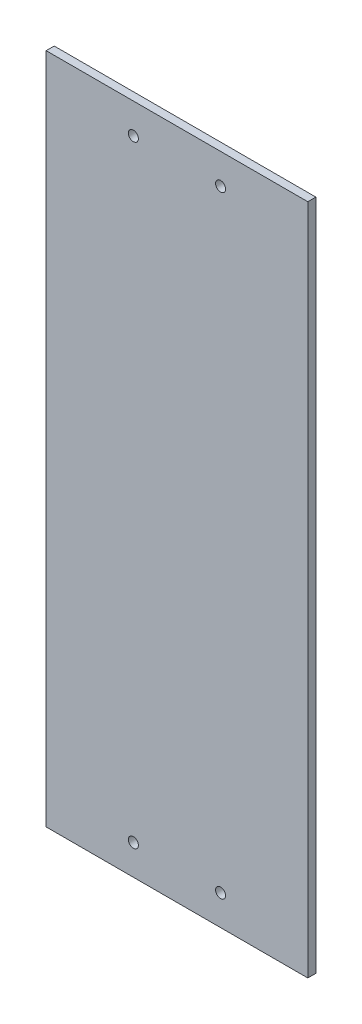
ISO-10303-21;
HEADER;
FILE_DESCRIPTION(('STEP AP214'),'2;1');
FILE_NAME('part.step','',(''),(''),'','','');
FILE_SCHEMA(('AUTOMOTIVE_DESIGN { 1 0 10303 214 1 1 1 1 }'));
ENDSEC;
DATA;
#1=APPLICATION_CONTEXT('core data for automotive mechanical design processes');
#2=APPLICATION_PROTOCOL_DEFINITION('international standard','automotive_design',2000,#1);
#3=PRODUCT_CONTEXT('',#1,'mechanical');
#4=PRODUCT('Part','Part','',(#3));
#5=PRODUCT_RELATED_PRODUCT_CATEGORY('part','',(#4));
#6=PRODUCT_DEFINITION_FORMATION('','',#4);
#7=PRODUCT_DEFINITION_CONTEXT('part definition',#1,'design');
#8=PRODUCT_DEFINITION('design','',#6,#7);
#9=PRODUCT_DEFINITION_SHAPE('','',#8);
#10=(LENGTH_UNIT() NAMED_UNIT(*) SI_UNIT(.MILLI.,.METRE.));
#11=(NAMED_UNIT(*) PLANE_ANGLE_UNIT() SI_UNIT($,.RADIAN.));
#12=(NAMED_UNIT(*) SI_UNIT($,.STERADIAN.) SOLID_ANGLE_UNIT());
#13=UNCERTAINTY_MEASURE_WITH_UNIT(LENGTH_MEASURE(1.E-05),#10,'distance_accuracy_value','');
#14=(GEOMETRIC_REPRESENTATION_CONTEXT(3) GLOBAL_UNCERTAINTY_ASSIGNED_CONTEXT((#13)) GLOBAL_UNIT_ASSIGNED_CONTEXT((#10,
#11,#12)) REPRESENTATION_CONTEXT('',''));
#15=CARTESIAN_POINT('',(0.,0.,0.));
#16=DIRECTION('',(0.,0.,1.));
#17=DIRECTION('',(1.,0.,0.));
#18=AXIS2_PLACEMENT_3D('',#15,#16,#17);
#19=CARTESIAN_POINT('',(0.,0.,4.));
#20=DIRECTION('',(0.,0.,-1.));
#21=DIRECTION('',(-1.,0.,0.));
#22=AXIS2_PLACEMENT_3D('',#19,#20,#21);
#23=PLANE('',#22);
#24=DIRECTION('',(0.,1.,0.));
#25=VECTOR('',#24,1.);
#26=CARTESIAN_POINT('',(53.676310867893,179.876130384089,4.));
#27=LINE('',#26,#25);
#28=CARTESIAN_POINT('',(53.676310867893,-154.123869615911,4.));
#29=VERTEX_POINT('',#28);
#30=CARTESIAN_POINT('',(53.676310867893,179.876130384089,4.));
#31=VERTEX_POINT('',#30);
#32=EDGE_CURVE('E85',#29,#31,#27,.T.);
#33=ORIENTED_EDGE('',*,*,#32,.T.);
#34=DIRECTION('',(-1.,0.,0.));
#35=VECTOR('',#34,1.);
#36=CARTESIAN_POINT('',(53.676310867893,179.876130384089,4.));
#37=LINE('',#36,#35);
#38=CARTESIAN_POINT('',(-76.323689132107,179.876130384089,4.));
#39=VERTEX_POINT('',#38);
#40=EDGE_CURVE('E80',#31,#39,#37,.T.);
#41=ORIENTED_EDGE('',*,*,#40,.T.);
#42=DIRECTION('',(0.,-1.,0.));
#43=VECTOR('',#42,1.);
#44=CARTESIAN_POINT('',(-76.323689132107,179.876130384089,4.));
#45=LINE('',#44,#43);
#46=CARTESIAN_POINT('',(-76.323689132107,-154.123869615911,4.));
#47=VERTEX_POINT('',#46);
#48=EDGE_CURVE('E83',#39,#47,#45,.T.);
#49=ORIENTED_EDGE('',*,*,#48,.T.);
#50=DIRECTION('',(1.,0.,0.));
#51=VECTOR('',#50,1.);
#52=CARTESIAN_POINT('',(53.676310867893,-154.123869615911,4.));
#53=LINE('',#52,#51);
#54=EDGE_CURVE('E50',#47,#29,#53,.T.);
#55=ORIENTED_EDGE('',*,*,#54,.T.);
#56=EDGE_LOOP('',(#33,#41,#49,#55));
#57=FACE_BOUND('',#56,.T.);
#58=CARTESIAN_POINT('',(10.3429775345597,164.876130384089,4.));
#59=DIRECTION('',(0.,0.,1.));
#60=DIRECTION('',(1.,0.,0.));
#61=AXIS2_PLACEMENT_3D('',#58,#59,#60);
#62=CIRCLE('',#61,2.50000000000001);
#63=CARTESIAN_POINT('',(12.8429775345597,164.876130384089,4.));
#64=VERTEX_POINT('',#63);
#65=EDGE_CURVE('E100',#64,#64,#62,.T.);
#66=ORIENTED_EDGE('',*,*,#65,.F.);
#67=EDGE_LOOP('',(#66));
#68=FACE_BOUND('',#67,.T.);
#69=CARTESIAN_POINT('',(-32.9903557987736,164.876130384089,4.));
#70=DIRECTION('',(0.,0.,1.));
#71=DIRECTION('',(1.,0.,0.));
#72=AXIS2_PLACEMENT_3D('',#69,#70,#71);
#73=CIRCLE('',#72,2.5);
#74=CARTESIAN_POINT('',(-30.4903557987736,164.876130384089,4.));
#75=VERTEX_POINT('',#74);
#76=EDGE_CURVE('E115',#75,#75,#73,.T.);
#77=ORIENTED_EDGE('',*,*,#76,.F.);
#78=EDGE_LOOP('',(#77));
#79=FACE_BOUND('',#78,.T.);
#80=CARTESIAN_POINT('',(10.3429775345597,-139.123869615911,4.));
#81=DIRECTION('',(0.,0.,1.));
#82=DIRECTION('',(1.,0.,0.));
#83=AXIS2_PLACEMENT_3D('',#80,#81,#82);
#84=CIRCLE('',#83,2.50000000000001);
#85=CARTESIAN_POINT('',(12.8429775345597,-139.123869615911,4.));
#86=VERTEX_POINT('',#85);
#87=EDGE_CURVE('E121',#86,#86,#84,.T.);
#88=ORIENTED_EDGE('',*,*,#87,.F.);
#89=EDGE_LOOP('',(#88));
#90=FACE_BOUND('',#89,.T.);
#91=CARTESIAN_POINT('',(-32.9903557987736,-139.123869615911,4.));
#92=DIRECTION('',(0.,0.,1.));
#93=DIRECTION('',(1.,0.,0.));
#94=AXIS2_PLACEMENT_3D('',#91,#92,#93);
#95=CIRCLE('',#94,2.5);
#96=CARTESIAN_POINT('',(-30.4903557987736,-139.123869615911,4.));
#97=VERTEX_POINT('',#96);
#98=EDGE_CURVE('E127',#97,#97,#95,.T.);
#99=ORIENTED_EDGE('',*,*,#98,.F.);
#100=EDGE_LOOP('',(#99));
#101=FACE_BOUND('',#100,.T.);
#102=ADVANCED_FACE('F33',(#57,#68,#79,#90,#101),#23,.F.);
#103=CARTESIAN_POINT('',(0.,0.,0.));
#104=DIRECTION('',(0.,0.,-1.));
#105=DIRECTION('',(-1.,0.,0.));
#106=AXIS2_PLACEMENT_3D('',#103,#104,#105);
#107=PLANE('',#106);
#108=CARTESIAN_POINT('',(10.3429775345597,-139.123869615911,0.));
#109=DIRECTION('',(0.,0.,1.));
#110=DIRECTION('',(1.,0.,0.));
#111=AXIS2_PLACEMENT_3D('',#108,#109,#110);
#112=CIRCLE('',#111,2.50000000000001);
#113=CARTESIAN_POINT('',(12.8429775345597,-139.123869615911,0.));
#114=VERTEX_POINT('',#113);
#115=EDGE_CURVE('E124',#114,#114,#112,.T.);
#116=ORIENTED_EDGE('',*,*,#115,.T.);
#117=EDGE_LOOP('',(#116));
#118=FACE_BOUND('',#117,.T.);
#119=CARTESIAN_POINT('',(10.3429775345597,164.876130384089,0.));
#120=DIRECTION('',(0.,0.,1.));
#121=DIRECTION('',(1.,0.,0.));
#122=AXIS2_PLACEMENT_3D('',#119,#120,#121);
#123=CIRCLE('',#122,2.50000000000001);
#124=CARTESIAN_POINT('',(12.8429775345597,164.876130384089,0.));
#125=VERTEX_POINT('',#124);
#126=EDGE_CURVE('E112',#125,#125,#123,.T.);
#127=ORIENTED_EDGE('',*,*,#126,.T.);
#128=EDGE_LOOP('',(#127));
#129=FACE_BOUND('',#128,.T.);
#130=DIRECTION('',(0.,1.,0.));
#131=VECTOR('',#130,1.);
#132=CARTESIAN_POINT('',(53.676310867893,179.876130384089,0.));
#133=LINE('',#132,#131);
#134=CARTESIAN_POINT('',(53.676310867893,-154.123869615911,0.));
#135=VERTEX_POINT('',#134);
#136=CARTESIAN_POINT('',(53.676310867893,179.876130384089,0.));
#137=VERTEX_POINT('',#136);
#138=EDGE_CURVE('E97',#135,#137,#133,.T.);
#139=ORIENTED_EDGE('',*,*,#138,.F.);
#140=DIRECTION('',(1.,0.,0.));
#141=VECTOR('',#140,1.);
#142=CARTESIAN_POINT('',(53.676310867893,-154.123869615911,0.));
#143=LINE('',#142,#141);
#144=CARTESIAN_POINT('',(-76.323689132107,-154.123869615911,0.));
#145=VERTEX_POINT('',#144);
#146=EDGE_CURVE('E73',#145,#135,#143,.T.);
#147=ORIENTED_EDGE('',*,*,#146,.F.);
#148=DIRECTION('',(0.,-1.,0.));
#149=VECTOR('',#148,1.);
#150=CARTESIAN_POINT('',(-76.323689132107,179.876130384089,0.));
#151=LINE('',#150,#149);
#152=CARTESIAN_POINT('',(-76.323689132107,179.876130384089,0.));
#153=VERTEX_POINT('',#152);
#154=EDGE_CURVE('E67',#153,#145,#151,.T.);
#155=ORIENTED_EDGE('',*,*,#154,.F.);
#156=DIRECTION('',(-1.,0.,0.));
#157=VECTOR('',#156,1.);
#158=CARTESIAN_POINT('',(53.676310867893,179.876130384089,0.));
#159=LINE('',#158,#157);
#160=EDGE_CURVE('E89',#137,#153,#159,.T.);
#161=ORIENTED_EDGE('',*,*,#160,.F.);
#162=EDGE_LOOP('',(#139,#147,#155,#161));
#163=FACE_BOUND('',#162,.T.);
#164=CARTESIAN_POINT('',(-32.9903557987736,164.876130384089,0.));
#165=DIRECTION('',(0.,0.,1.));
#166=DIRECTION('',(1.,0.,0.));
#167=AXIS2_PLACEMENT_3D('',#164,#165,#166);
#168=CIRCLE('',#167,2.5);
#169=CARTESIAN_POINT('',(-30.4903557987736,164.876130384089,0.));
#170=VERTEX_POINT('',#169);
#171=EDGE_CURVE('E118',#170,#170,#168,.T.);
#172=ORIENTED_EDGE('',*,*,#171,.T.);
#173=EDGE_LOOP('',(#172));
#174=FACE_BOUND('',#173,.T.);
#175=CARTESIAN_POINT('',(-32.9903557987736,-139.123869615911,0.));
#176=DIRECTION('',(0.,0.,1.));
#177=DIRECTION('',(1.,0.,0.));
#178=AXIS2_PLACEMENT_3D('',#175,#176,#177);
#179=CIRCLE('',#178,2.5);
#180=CARTESIAN_POINT('',(-30.4903557987736,-139.123869615911,0.));
#181=VERTEX_POINT('',#180);
#182=EDGE_CURVE('E130',#181,#181,#179,.T.);
#183=ORIENTED_EDGE('',*,*,#182,.T.);
#184=EDGE_LOOP('',(#183));
#185=FACE_BOUND('',#184,.T.);
#186=ADVANCED_FACE('F108',(#118,#129,#163,#174,#185),#107,.T.);
#187=CARTESIAN_POINT('',(53.676310867893,179.876130384089,4.));
#188=DIRECTION('',(-1.,0.,0.));
#189=DIRECTION('',(0.,0.,1.));
#190=AXIS2_PLACEMENT_3D('',#187,#188,#189);
#191=PLANE('',#190);
#192=ORIENTED_EDGE('',*,*,#138,.T.);
#193=DIRECTION('',(0.,0.,-1.));
#194=VECTOR('',#193,1.);
#195=CARTESIAN_POINT('',(53.676310867893,179.876130384089,4.));
#196=LINE('',#195,#194);
#197=EDGE_CURVE('E11',#31,#137,#196,.T.);
#198=ORIENTED_EDGE('',*,*,#197,.F.);
#199=ORIENTED_EDGE('',*,*,#32,.F.);
#200=DIRECTION('',(0.,0.,-1.));
#201=VECTOR('',#200,1.);
#202=CARTESIAN_POINT('',(53.676310867893,-154.123869615911,4.));
#203=LINE('',#202,#201);
#204=EDGE_CURVE('E93',#29,#135,#203,.T.);
#205=ORIENTED_EDGE('',*,*,#204,.T.);
#206=EDGE_LOOP('',(#192,#198,#199,#205));
#207=FACE_BOUND('',#206,.T.);
#208=ADVANCED_FACE('F35',(#207),#191,.F.);
#209=CARTESIAN_POINT('',(53.676310867893,179.876130384089,4.));
#210=DIRECTION('',(0.,-1.,0.));
#211=DIRECTION('',(0.,0.,-1.));
#212=AXIS2_PLACEMENT_3D('',#209,#210,#211);
#213=PLANE('',#212);
#214=ORIENTED_EDGE('',*,*,#160,.T.);
#215=DIRECTION('',(0.,0.,-1.));
#216=VECTOR('',#215,1.);
#217=CARTESIAN_POINT('',(-76.323689132107,179.876130384089,4.));
#218=LINE('',#217,#216);
#219=EDGE_CURVE('E42',#39,#153,#218,.T.);
#220=ORIENTED_EDGE('',*,*,#219,.F.);
#221=ORIENTED_EDGE('',*,*,#40,.F.);
#222=ORIENTED_EDGE('',*,*,#197,.T.);
#223=EDGE_LOOP('',(#214,#220,#221,#222));
#224=FACE_BOUND('',#223,.T.);
#225=ADVANCED_FACE('F88',(#224),#213,.F.);
#226=CARTESIAN_POINT('',(-76.323689132107,179.876130384089,4.));
#227=DIRECTION('',(1.,0.,0.));
#228=DIRECTION('',(0.,0.,-1.));
#229=AXIS2_PLACEMENT_3D('',#226,#227,#228);
#230=PLANE('',#229);
#231=ORIENTED_EDGE('',*,*,#154,.T.);
#232=DIRECTION('',(0.,0.,-1.));
#233=VECTOR('',#232,1.);
#234=CARTESIAN_POINT('',(-76.323689132107,-154.123869615911,4.));
#235=LINE('',#234,#233);
#236=EDGE_CURVE('E90',#47,#145,#235,.T.);
#237=ORIENTED_EDGE('',*,*,#236,.F.);
#238=ORIENTED_EDGE('',*,*,#48,.F.);
#239=ORIENTED_EDGE('',*,*,#219,.T.);
#240=EDGE_LOOP('',(#231,#237,#238,#239));
#241=FACE_BOUND('',#240,.T.);
#242=ADVANCED_FACE('F91',(#241),#230,.F.);
#243=CARTESIAN_POINT('',(53.676310867893,-154.123869615911,4.));
#244=DIRECTION('',(0.,1.,0.));
#245=DIRECTION('',(0.,0.,1.));
#246=AXIS2_PLACEMENT_3D('',#243,#244,#245);
#247=PLANE('',#246);
#248=ORIENTED_EDGE('',*,*,#146,.T.);
#249=ORIENTED_EDGE('',*,*,#204,.F.);
#250=ORIENTED_EDGE('',*,*,#54,.F.);
#251=ORIENTED_EDGE('',*,*,#236,.T.);
#252=EDGE_LOOP('',(#248,#249,#250,#251));
#253=FACE_BOUND('',#252,.T.);
#254=ADVANCED_FACE('F105',(#253),#247,.F.);
#255=CARTESIAN_POINT('',(10.3429775345597,164.876130384089,4.));
#256=DIRECTION('',(0.,0.,-1.));
#257=DIRECTION('',(-1.,0.,0.));
#258=AXIS2_PLACEMENT_3D('',#255,#256,#257);
#259=CYLINDRICAL_SURFACE('',#258,2.50000000000001);
#260=ORIENTED_EDGE('',*,*,#65,.T.);
#261=EDGE_LOOP('',(#260));
#262=FACE_BOUND('',#261,.T.);
#263=ORIENTED_EDGE('',*,*,#126,.F.);
#264=EDGE_LOOP('',(#263));
#265=FACE_BOUND('',#264,.T.);
#266=ADVANCED_FACE('F147',(#262,#265),#259,.F.);
#267=CARTESIAN_POINT('',(-32.9903557987736,164.876130384089,4.));
#268=DIRECTION('',(0.,0.,-1.));
#269=DIRECTION('',(-1.,0.,0.));
#270=AXIS2_PLACEMENT_3D('',#267,#268,#269);
#271=CYLINDRICAL_SURFACE('',#270,2.5);
#272=ORIENTED_EDGE('',*,*,#76,.T.);
#273=EDGE_LOOP('',(#272));
#274=FACE_BOUND('',#273,.T.);
#275=ORIENTED_EDGE('',*,*,#171,.F.);
#276=EDGE_LOOP('',(#275));
#277=FACE_BOUND('',#276,.T.);
#278=ADVANCED_FACE('F193',(#274,#277),#271,.F.);
#279=CARTESIAN_POINT('',(10.3429775345597,-139.123869615911,4.));
#280=DIRECTION('',(0.,0.,-1.));
#281=DIRECTION('',(-1.,0.,0.));
#282=AXIS2_PLACEMENT_3D('',#279,#280,#281);
#283=CYLINDRICAL_SURFACE('',#282,2.50000000000001);
#284=ORIENTED_EDGE('',*,*,#87,.T.);
#285=EDGE_LOOP('',(#284));
#286=FACE_BOUND('',#285,.T.);
#287=ORIENTED_EDGE('',*,*,#115,.F.);
#288=EDGE_LOOP('',(#287));
#289=FACE_BOUND('',#288,.T.);
#290=ADVANCED_FACE('F201',(#286,#289),#283,.F.);
#291=CARTESIAN_POINT('',(-32.9903557987736,-139.123869615911,4.));
#292=DIRECTION('',(0.,0.,-1.));
#293=DIRECTION('',(-1.,0.,0.));
#294=AXIS2_PLACEMENT_3D('',#291,#292,#293);
#295=CYLINDRICAL_SURFACE('',#294,2.5);
#296=ORIENTED_EDGE('',*,*,#98,.T.);
#297=EDGE_LOOP('',(#296));
#298=FACE_BOUND('',#297,.T.);
#299=ORIENTED_EDGE('',*,*,#182,.F.);
#300=EDGE_LOOP('',(#299));
#301=FACE_BOUND('',#300,.T.);
#302=ADVANCED_FACE('F136',(#298,#301),#295,.F.);
#303=CLOSED_SHELL('',(#102,#186,#208,#225,#242,#254,#266,#278,#290,#302));
#304=MANIFOLD_SOLID_BREP('B2',#303);
#305=ADVANCED_BREP_SHAPE_REPRESENTATION('',(#18,#304),#14);
#306=SHAPE_DEFINITION_REPRESENTATION(#9,#305);
ENDSEC;
END-ISO-10303-21;
